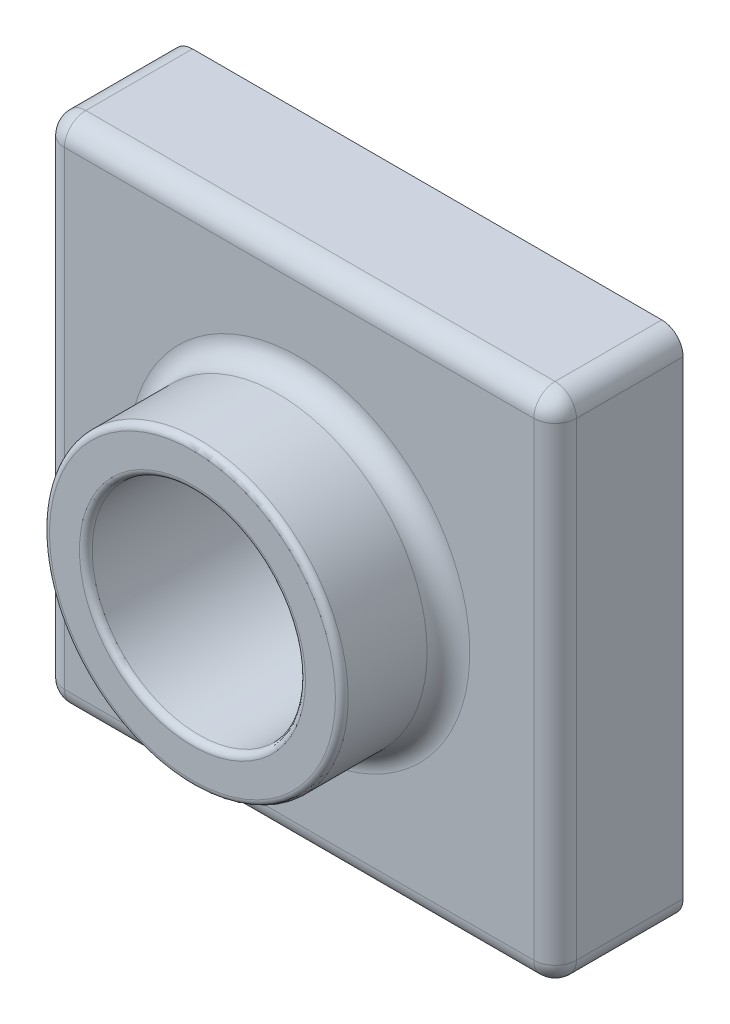
ISO-10303-21;
HEADER;
FILE_DESCRIPTION(('STEP AP214'),'2;1');
FILE_NAME('part.step','',(''),(''),'','','');
FILE_SCHEMA(('AUTOMOTIVE_DESIGN { 1 0 10303 214 1 1 1 1 }'));
ENDSEC;
DATA;
#1=APPLICATION_CONTEXT('core data for automotive mechanical design processes');
#2=APPLICATION_PROTOCOL_DEFINITION('international standard','automotive_design',2000,#1);
#3=PRODUCT_CONTEXT('',#1,'mechanical');
#4=PRODUCT('Part','Part','',(#3));
#5=PRODUCT_RELATED_PRODUCT_CATEGORY('part','',(#4));
#6=PRODUCT_DEFINITION_FORMATION('','',#4);
#7=PRODUCT_DEFINITION_CONTEXT('part definition',#1,'design');
#8=PRODUCT_DEFINITION('design','',#6,#7);
#9=PRODUCT_DEFINITION_SHAPE('','',#8);
#10=(LENGTH_UNIT() NAMED_UNIT(*) SI_UNIT(.MILLI.,.METRE.));
#11=(NAMED_UNIT(*) PLANE_ANGLE_UNIT() SI_UNIT($,.RADIAN.));
#12=(NAMED_UNIT(*) SI_UNIT($,.STERADIAN.) SOLID_ANGLE_UNIT());
#13=UNCERTAINTY_MEASURE_WITH_UNIT(LENGTH_MEASURE(1.E-05),#10,'distance_accuracy_value','');
#14=(GEOMETRIC_REPRESENTATION_CONTEXT(3) GLOBAL_UNCERTAINTY_ASSIGNED_CONTEXT((#13)) GLOBAL_UNIT_ASSIGNED_CONTEXT((#10,
#11,#12)) REPRESENTATION_CONTEXT('',''));
#15=CARTESIAN_POINT('',(0.,0.,0.));
#16=DIRECTION('',(0.,0.,1.));
#17=DIRECTION('',(1.,0.,0.));
#18=AXIS2_PLACEMENT_3D('',#15,#16,#17);
#19=CARTESIAN_POINT('',(0.,0.,0.));
#20=DIRECTION('',(0.,0.,-1.));
#21=DIRECTION('',(-1.,0.,0.));
#22=AXIS2_PLACEMENT_3D('',#19,#20,#21);
#23=PLANE('',#22);
#24=DIRECTION('',(1.,0.,0.));
#25=VECTOR('',#24,1.);
#26=CARTESIAN_POINT('',(0.,0.,0.));
#27=LINE('',#26,#25);
#28=CARTESIAN_POINT('',(5.,0.,0.));
#29=VERTEX_POINT('',#28);
#30=CARTESIAN_POINT('',(115.,0.,0.));
#31=VERTEX_POINT('',#30);
#32=EDGE_CURVE('E280',#29,#31,#27,.T.);
#33=ORIENTED_EDGE('',*,*,#32,.F.);
#34=CARTESIAN_POINT('',(5.,5.,0.));
#35=DIRECTION('',(0.,0.,-1.));
#36=DIRECTION('',(-1.,0.,0.));
#37=AXIS2_PLACEMENT_3D('',#34,#35,#36);
#38=CIRCLE('',#37,5.);
#39=CARTESIAN_POINT('',(0.,5.,0.));
#40=VERTEX_POINT('',#39);
#41=EDGE_CURVE('E311',#29,#40,#38,.T.);
#42=ORIENTED_EDGE('',*,*,#41,.T.);
#43=DIRECTION('',(0.,-1.,0.));
#44=VECTOR('',#43,1.);
#45=CARTESIAN_POINT('',(0.,0.,0.));
#46=LINE('',#45,#44);
#47=CARTESIAN_POINT('',(0.,115.,0.));
#48=VERTEX_POINT('',#47);
#49=EDGE_CURVE('E275',#48,#40,#46,.T.);
#50=ORIENTED_EDGE('',*,*,#49,.F.);
#51=CARTESIAN_POINT('',(5.,115.,0.));
#52=DIRECTION('',(0.,0.,-1.));
#53=DIRECTION('',(-1.,0.,0.));
#54=AXIS2_PLACEMENT_3D('',#51,#52,#53);
#55=CIRCLE('',#54,5.);
#56=CARTESIAN_POINT('',(5.,120.,0.));
#57=VERTEX_POINT('',#56);
#58=EDGE_CURVE('E308',#48,#57,#55,.T.);
#59=ORIENTED_EDGE('',*,*,#58,.T.);
#60=DIRECTION('',(-1.,0.,0.));
#61=VECTOR('',#60,1.);
#62=CARTESIAN_POINT('',(0.,120.,0.));
#63=LINE('',#62,#61);
#64=CARTESIAN_POINT('',(115.,120.,0.));
#65=VERTEX_POINT('',#64);
#66=EDGE_CURVE('E288',#65,#57,#63,.T.);
#67=ORIENTED_EDGE('',*,*,#66,.F.);
#68=CARTESIAN_POINT('',(115.,115.,0.));
#69=DIRECTION('',(0.,0.,-1.));
#70=DIRECTION('',(-1.,0.,0.));
#71=AXIS2_PLACEMENT_3D('',#68,#69,#70);
#72=CIRCLE('',#71,5.);
#73=CARTESIAN_POINT('',(120.,115.,0.));
#74=VERTEX_POINT('',#73);
#75=EDGE_CURVE('E302',#65,#74,#72,.T.);
#76=ORIENTED_EDGE('',*,*,#75,.T.);
#77=DIRECTION('',(0.,1.,0.));
#78=VECTOR('',#77,1.);
#79=CARTESIAN_POINT('',(120.,0.,0.));
#80=LINE('',#79,#78);
#81=CARTESIAN_POINT('',(120.,5.,0.));
#82=VERTEX_POINT('',#81);
#83=EDGE_CURVE('E284',#82,#74,#80,.T.);
#84=ORIENTED_EDGE('',*,*,#83,.F.);
#85=CARTESIAN_POINT('',(115.,5.,0.));
#86=DIRECTION('',(0.,0.,-1.));
#87=DIRECTION('',(-1.,0.,0.));
#88=AXIS2_PLACEMENT_3D('',#85,#86,#87);
#89=CIRCLE('',#88,5.);
#90=EDGE_CURVE('E305',#82,#31,#89,.T.);
#91=ORIENTED_EDGE('',*,*,#90,.T.);
#92=EDGE_LOOP('',(#33,#42,#50,#59,#67,#76,#84,#91));
#93=FACE_BOUND('',#92,.T.);
#94=CARTESIAN_POINT('',(5.,5.,0.));
#95=DIRECTION('',(0.,0.,-1.));
#96=DIRECTION('',(-1.,0.,0.));
#97=AXIS2_PLACEMENT_3D('',#94,#95,#96);
#98=CIRCLE('',#97,3.);
#99=CARTESIAN_POINT('',(5.,2.,0.));
#100=VERTEX_POINT('',#99);
#101=CARTESIAN_POINT('',(2.,5.,0.));
#102=VERTEX_POINT('',#101);
#103=EDGE_CURVE('E189',#100,#102,#98,.T.);
#104=ORIENTED_EDGE('',*,*,#103,.F.);
#105=DIRECTION('',(1.,0.,0.));
#106=VECTOR('',#105,1.);
#107=CARTESIAN_POINT('',(0.,2.,0.));
#108=LINE('',#107,#106);
#109=CARTESIAN_POINT('',(115.,2.,0.));
#110=VERTEX_POINT('',#109);
#111=EDGE_CURVE('E243',#100,#110,#108,.T.);
#112=ORIENTED_EDGE('',*,*,#111,.T.);
#113=CARTESIAN_POINT('',(115.,5.,0.));
#114=DIRECTION('',(0.,0.,-1.));
#115=DIRECTION('',(-1.,0.,0.));
#116=AXIS2_PLACEMENT_3D('',#113,#114,#115);
#117=CIRCLE('',#116,3.);
#118=CARTESIAN_POINT('',(118.,5.,0.));
#119=VERTEX_POINT('',#118);
#120=EDGE_CURVE('E248',#119,#110,#117,.T.);
#121=ORIENTED_EDGE('',*,*,#120,.F.);
#122=DIRECTION('',(0.,1.,0.));
#123=VECTOR('',#122,1.);
#124=CARTESIAN_POINT('',(118.,0.,0.));
#125=LINE('',#124,#123);
#126=CARTESIAN_POINT('',(118.,115.,0.));
#127=VERTEX_POINT('',#126);
#128=EDGE_CURVE('E58',#119,#127,#125,.T.);
#129=ORIENTED_EDGE('',*,*,#128,.T.);
#130=CARTESIAN_POINT('',(115.,115.,0.));
#131=DIRECTION('',(0.,0.,-1.));
#132=DIRECTION('',(-1.,0.,0.));
#133=AXIS2_PLACEMENT_3D('',#130,#131,#132);
#134=CIRCLE('',#133,3.);
#135=CARTESIAN_POINT('',(115.,118.,0.));
#136=VERTEX_POINT('',#135);
#137=EDGE_CURVE('E254',#136,#127,#134,.T.);
#138=ORIENTED_EDGE('',*,*,#137,.F.);
#139=DIRECTION('',(-1.,0.,0.));
#140=VECTOR('',#139,1.);
#141=CARTESIAN_POINT('',(0.,118.,0.));
#142=LINE('',#141,#140);
#143=CARTESIAN_POINT('',(5.,118.,0.));
#144=VERTEX_POINT('',#143);
#145=EDGE_CURVE('E249',#136,#144,#142,.T.);
#146=ORIENTED_EDGE('',*,*,#145,.T.);
#147=CARTESIAN_POINT('',(5.,115.,0.));
#148=DIRECTION('',(0.,0.,-1.));
#149=DIRECTION('',(-1.,0.,0.));
#150=AXIS2_PLACEMENT_3D('',#147,#148,#149);
#151=CIRCLE('',#150,3.);
#152=CARTESIAN_POINT('',(2.,115.,0.));
#153=VERTEX_POINT('',#152);
#154=EDGE_CURVE('E245',#153,#144,#151,.T.);
#155=ORIENTED_EDGE('',*,*,#154,.F.);
#156=DIRECTION('',(0.,-1.,0.));
#157=VECTOR('',#156,1.);
#158=CARTESIAN_POINT('',(2.,0.,0.));
#159=LINE('',#158,#157);
#160=EDGE_CURVE('E240',#153,#102,#159,.T.);
#161=ORIENTED_EDGE('',*,*,#160,.T.);
#162=EDGE_LOOP('',(#104,#112,#121,#129,#138,#146,#155,#161));
#163=FACE_BOUND('',#162,.T.);
#164=ADVANCED_FACE('F42',(#93,#163),#23,.T.);
#165=CARTESIAN_POINT('',(0.,0.,30.));
#166=DIRECTION('',(1.,0.,0.));
#167=DIRECTION('',(0.,0.,-1.));
#168=AXIS2_PLACEMENT_3D('',#165,#166,#167);
#169=PLANE('',#168);
#170=ORIENTED_EDGE('',*,*,#49,.T.);
#171=DIRECTION('',(0.,0.,-1.));
#172=VECTOR('',#171,1.);
#173=CARTESIAN_POINT('',(0.,5.,30.));
#174=LINE('',#173,#172);
#175=CARTESIAN_POINT('',(0.,5.,25.));
#176=VERTEX_POINT('',#175);
#177=EDGE_CURVE('E320',#40,#176,#174,.F.);
#178=ORIENTED_EDGE('',*,*,#177,.T.);
#179=DIRECTION('',(0.,-1.,0.));
#180=VECTOR('',#179,1.);
#181=CARTESIAN_POINT('',(0.,0.,25.));
#182=LINE('',#181,#180);
#183=CARTESIAN_POINT('',(0.,115.,25.));
#184=VERTEX_POINT('',#183);
#185=EDGE_CURVE('E314',#176,#184,#182,.F.);
#186=ORIENTED_EDGE('',*,*,#185,.T.);
#187=DIRECTION('',(0.,0.,-1.));
#188=VECTOR('',#187,1.);
#189=CARTESIAN_POINT('',(0.,115.,30.));
#190=LINE('',#189,#188);
#191=EDGE_CURVE('E317',#184,#48,#190,.T.);
#192=ORIENTED_EDGE('',*,*,#191,.T.);
#193=EDGE_LOOP('',(#170,#178,#186,#192));
#194=FACE_BOUND('',#193,.T.);
#195=ADVANCED_FACE('F451',(#194),#169,.F.);
#196=CARTESIAN_POINT('',(0.,0.,30.));
#197=DIRECTION('',(0.,1.,0.));
#198=DIRECTION('',(0.,0.,1.));
#199=AXIS2_PLACEMENT_3D('',#196,#197,#198);
#200=PLANE('',#199);
#201=DIRECTION('',(1.,0.,0.));
#202=VECTOR('',#201,1.);
#203=CARTESIAN_POINT('',(0.,0.,25.));
#204=LINE('',#203,#202);
#205=CARTESIAN_POINT('',(115.,0.,25.));
#206=VERTEX_POINT('',#205);
#207=CARTESIAN_POINT('',(5.,0.,25.));
#208=VERTEX_POINT('',#207);
#209=EDGE_CURVE('E295',#206,#208,#204,.F.);
#210=ORIENTED_EDGE('',*,*,#209,.T.);
#211=DIRECTION('',(0.,0.,-1.));
#212=VECTOR('',#211,1.);
#213=CARTESIAN_POINT('',(5.,0.,30.));
#214=LINE('',#213,#212);
#215=EDGE_CURVE('E298',#208,#29,#214,.T.);
#216=ORIENTED_EDGE('',*,*,#215,.T.);
#217=ORIENTED_EDGE('',*,*,#32,.T.);
#218=DIRECTION('',(0.,0.,-1.));
#219=VECTOR('',#218,1.);
#220=CARTESIAN_POINT('',(115.,0.,30.));
#221=LINE('',#220,#219);
#222=EDGE_CURVE('E292',#31,#206,#221,.F.);
#223=ORIENTED_EDGE('',*,*,#222,.T.);
#224=EDGE_LOOP('',(#210,#216,#217,#223));
#225=FACE_BOUND('',#224,.T.);
#226=ADVANCED_FACE('F456',(#225),#200,.F.);
#227=CARTESIAN_POINT('',(120.,0.,30.));
#228=DIRECTION('',(-1.,0.,0.));
#229=DIRECTION('',(0.,0.,1.));
#230=AXIS2_PLACEMENT_3D('',#227,#228,#229);
#231=PLANE('',#230);
#232=DIRECTION('',(0.,1.,0.));
#233=VECTOR('',#232,1.);
#234=CARTESIAN_POINT('',(120.,0.,25.));
#235=LINE('',#234,#233);
#236=CARTESIAN_POINT('',(120.,115.,25.));
#237=VERTEX_POINT('',#236);
#238=CARTESIAN_POINT('',(120.,5.,25.));
#239=VERTEX_POINT('',#238);
#240=EDGE_CURVE('E66',#237,#239,#235,.F.);
#241=ORIENTED_EDGE('',*,*,#240,.T.);
#242=DIRECTION('',(0.,0.,-1.));
#243=VECTOR('',#242,1.);
#244=CARTESIAN_POINT('',(120.,5.,30.));
#245=LINE('',#244,#243);
#246=EDGE_CURVE('E354',#239,#82,#245,.T.);
#247=ORIENTED_EDGE('',*,*,#246,.T.);
#248=ORIENTED_EDGE('',*,*,#83,.T.);
#249=DIRECTION('',(0.,0.,-1.));
#250=VECTOR('',#249,1.);
#251=CARTESIAN_POINT('',(120.,115.,30.));
#252=LINE('',#251,#250);
#253=EDGE_CURVE('E349',#74,#237,#252,.F.);
#254=ORIENTED_EDGE('',*,*,#253,.T.);
#255=EDGE_LOOP('',(#241,#247,#248,#254));
#256=FACE_BOUND('',#255,.T.);
#257=ADVANCED_FACE('F1015',(#256),#231,.F.);
#258=CARTESIAN_POINT('',(0.,120.,30.));
#259=DIRECTION('',(0.,-1.,0.));
#260=DIRECTION('',(0.,0.,-1.));
#261=AXIS2_PLACEMENT_3D('',#258,#259,#260);
#262=PLANE('',#261);
#263=ORIENTED_EDGE('',*,*,#66,.T.);
#264=DIRECTION('',(0.,0.,-1.));
#265=VECTOR('',#264,1.);
#266=CARTESIAN_POINT('',(5.,120.,30.));
#267=LINE('',#266,#265);
#268=CARTESIAN_POINT('',(5.,120.,25.));
#269=VERTEX_POINT('',#268);
#270=EDGE_CURVE('E329',#57,#269,#267,.F.);
#271=ORIENTED_EDGE('',*,*,#270,.T.);
#272=DIRECTION('',(-1.,0.,0.));
#273=VECTOR('',#272,1.);
#274=CARTESIAN_POINT('',(0.,120.,25.));
#275=LINE('',#274,#273);
#276=CARTESIAN_POINT('',(115.,120.,25.));
#277=VERTEX_POINT('',#276);
#278=EDGE_CURVE('E326',#269,#277,#275,.F.);
#279=ORIENTED_EDGE('',*,*,#278,.T.);
#280=DIRECTION('',(0.,0.,-1.));
#281=VECTOR('',#280,1.);
#282=CARTESIAN_POINT('',(115.,120.,30.));
#283=LINE('',#282,#281);
#284=EDGE_CURVE('E323',#277,#65,#283,.T.);
#285=ORIENTED_EDGE('',*,*,#284,.T.);
#286=EDGE_LOOP('',(#263,#271,#279,#285));
#287=FACE_BOUND('',#286,.T.);
#288=ADVANCED_FACE('F445',(#287),#262,.F.);
#289=CARTESIAN_POINT('',(0.,0.,30.));
#290=DIRECTION('',(0.,0.,-1.));
#291=DIRECTION('',(-1.,0.,0.));
#292=AXIS2_PLACEMENT_3D('',#289,#290,#291);
#293=PLANE('',#292);
#294=DIRECTION('',(-1.,0.,0.));
#295=VECTOR('',#294,1.);
#296=CARTESIAN_POINT('',(0.,115.,30.));
#297=LINE('',#296,#295);
#298=CARTESIAN_POINT('',(115.,115.,30.));
#299=VERTEX_POINT('',#298);
#300=CARTESIAN_POINT('',(5.,115.,30.));
#301=VERTEX_POINT('',#300);
#302=EDGE_CURVE('E336',#299,#301,#297,.T.);
#303=ORIENTED_EDGE('',*,*,#302,.T.);
#304=DIRECTION('',(0.,-1.,0.));
#305=VECTOR('',#304,1.);
#306=CARTESIAN_POINT('',(5.,0.,30.));
#307=LINE('',#306,#305);
#308=CARTESIAN_POINT('',(5.,5.,30.));
#309=VERTEX_POINT('',#308);
#310=EDGE_CURVE('E345',#301,#309,#307,.T.);
#311=ORIENTED_EDGE('',*,*,#310,.T.);
#312=DIRECTION('',(1.,0.,0.));
#313=VECTOR('',#312,1.);
#314=CARTESIAN_POINT('',(0.,5.,30.));
#315=LINE('',#314,#313);
#316=CARTESIAN_POINT('',(115.,5.,30.));
#317=VERTEX_POINT('',#316);
#318=EDGE_CURVE('E342',#309,#317,#315,.T.);
#319=ORIENTED_EDGE('',*,*,#318,.T.);
#320=DIRECTION('',(0.,1.,0.));
#321=VECTOR('',#320,1.);
#322=CARTESIAN_POINT('',(115.,0.,30.));
#323=LINE('',#322,#321);
#324=EDGE_CURVE('E339',#317,#299,#323,.T.);
#325=ORIENTED_EDGE('',*,*,#324,.T.);
#326=EDGE_LOOP('',(#303,#311,#319,#325));
#327=FACE_BOUND('',#326,.T.);
#328=CARTESIAN_POINT('',(60.,60.,30.));
#329=DIRECTION('',(0.,0.,-1.));
#330=DIRECTION('',(-1.,0.,0.));
#331=AXIS2_PLACEMENT_3D('',#328,#329,#330);
#332=CIRCLE('',#331,40.);
#333=CARTESIAN_POINT('',(20.,60.,30.));
#334=VERTEX_POINT('',#333);
#335=EDGE_CURVE('E332',#334,#334,#332,.T.);
#336=ORIENTED_EDGE('',*,*,#335,.T.);
#337=EDGE_LOOP('',(#336));
#338=FACE_BOUND('',#337,.T.);
#339=ADVANCED_FACE('F436',(#327,#338),#293,.F.);
#340=CARTESIAN_POINT('',(60.,60.,0.));
#341=DIRECTION('',(0.,0.,-1.));
#342=DIRECTION('',(-1.,0.,0.));
#343=AXIS2_PLACEMENT_3D('',#340,#341,#342);
#344=CIRCLE('',#343,27.);
#345=CARTESIAN_POINT('',(33.,60.,0.));
#346=VERTEX_POINT('',#345);
#347=EDGE_CURVE('E244',#346,#346,#344,.F.);
#348=ORIENTED_EDGE('',*,*,#347,.F.);
#349=EDGE_LOOP('',(#348));
#350=FACE_BOUND('',#349,.T.);
#351=CARTESIAN_POINT('',(60.,60.,0.));
#352=DIRECTION('',(0.,0.,1.));
#353=DIRECTION('',(1.,0.,0.));
#354=AXIS2_PLACEMENT_3D('',#351,#352,#353);
#355=CIRCLE('',#354,25.);
#356=CARTESIAN_POINT('',(85.,60.,0.));
#357=VERTEX_POINT('',#356);
#358=EDGE_CURVE('E271',#357,#357,#355,.T.);
#359=ORIENTED_EDGE('',*,*,#358,.T.);
#360=EDGE_LOOP('',(#359));
#361=FACE_BOUND('',#360,.T.);
#362=ADVANCED_FACE('F433',(#350,#361),#23,.T.);
#363=CARTESIAN_POINT('',(60.,60.,55.));
#364=DIRECTION('',(0.,0.,-1.));
#365=DIRECTION('',(-1.,0.,0.));
#366=AXIS2_PLACEMENT_3D('',#363,#364,#365);
#367=CYLINDRICAL_SURFACE('',#366,35.);
#368=CARTESIAN_POINT('',(60.,60.,53.5));
#369=DIRECTION('',(0.,0.,1.));
#370=DIRECTION('',(1.,0.,0.));
#371=AXIS2_PLACEMENT_3D('',#368,#369,#370);
#372=CIRCLE('',#371,35.);
#373=CARTESIAN_POINT('',(95.,60.,53.5));
#374=VERTEX_POINT('',#373);
#375=EDGE_CURVE('E11',#374,#374,#372,.F.);
#376=ORIENTED_EDGE('',*,*,#375,.T.);
#377=EDGE_LOOP('',(#376));
#378=FACE_BOUND('',#377,.T.);
#379=CARTESIAN_POINT('',(60.,60.,35.));
#380=DIRECTION('',(0.,0.,-1.));
#381=DIRECTION('',(-1.,0.,0.));
#382=AXIS2_PLACEMENT_3D('',#379,#380,#381);
#383=CIRCLE('',#382,35.);
#384=CARTESIAN_POINT('',(25.,60.,35.));
#385=VERTEX_POINT('',#384);
#386=EDGE_CURVE('E357',#385,#385,#383,.F.);
#387=ORIENTED_EDGE('',*,*,#386,.T.);
#388=EDGE_LOOP('',(#387));
#389=FACE_BOUND('',#388,.T.);
#390=ADVANCED_FACE('F435',(#378,#389),#367,.T.);
#391=CARTESIAN_POINT('',(60.,60.,55.));
#392=DIRECTION('',(0.,0.,1.));
#393=DIRECTION('',(1.,0.,0.));
#394=AXIS2_PLACEMENT_3D('',#391,#392,#393);
#395=PLANE('',#394);
#396=CARTESIAN_POINT('',(60.,60.,55.));
#397=DIRECTION('',(0.,0.,1.));
#398=DIRECTION('',(1.,0.,0.));
#399=AXIS2_PLACEMENT_3D('',#396,#397,#398);
#400=CIRCLE('',#399,26.5);
#401=CARTESIAN_POINT('',(86.5,60.,55.));
#402=VERTEX_POINT('',#401);
#403=EDGE_CURVE('E51',#402,#402,#400,.F.);
#404=ORIENTED_EDGE('',*,*,#403,.T.);
#405=EDGE_LOOP('',(#404));
#406=FACE_BOUND('',#405,.T.);
#407=CARTESIAN_POINT('',(60.,60.,55.));
#408=DIRECTION('',(0.,0.,1.));
#409=DIRECTION('',(1.,0.,0.));
#410=AXIS2_PLACEMENT_3D('',#407,#408,#409);
#411=CIRCLE('',#410,33.5);
#412=CARTESIAN_POINT('',(93.5,60.,55.));
#413=VERTEX_POINT('',#412);
#414=EDGE_CURVE('E410',#413,#413,#411,.T.);
#415=ORIENTED_EDGE('',*,*,#414,.T.);
#416=EDGE_LOOP('',(#415));
#417=FACE_BOUND('',#416,.T.);
#418=ADVANCED_FACE('F417',(#406,#417),#395,.T.);
#419=CARTESIAN_POINT('',(60.,60.,0.));
#420=DIRECTION('',(0.,0.,1.));
#421=DIRECTION('',(1.,0.,0.));
#422=AXIS2_PLACEMENT_3D('',#419,#420,#421);
#423=CYLINDRICAL_SURFACE('',#422,25.);
#424=CARTESIAN_POINT('',(60.,60.,53.5));
#425=DIRECTION('',(0.,0.,1.));
#426=DIRECTION('',(1.,0.,0.));
#427=AXIS2_PLACEMENT_3D('',#424,#425,#426);
#428=CIRCLE('',#427,25.);
#429=CARTESIAN_POINT('',(85.,60.,53.5));
#430=VERTEX_POINT('',#429);
#431=EDGE_CURVE('E361',#430,#430,#428,.T.);
#432=ORIENTED_EDGE('',*,*,#431,.T.);
#433=EDGE_LOOP('',(#432));
#434=FACE_BOUND('',#433,.T.);
#435=ORIENTED_EDGE('',*,*,#358,.F.);
#436=EDGE_LOOP('',(#435));
#437=FACE_BOUND('',#436,.T.);
#438=ADVANCED_FACE('F426',(#434,#437),#423,.F.);
#439=CARTESIAN_POINT('',(115.,115.,30.));
#440=DIRECTION('',(0.,0.,-1.));
#441=DIRECTION('',(-1.,0.,0.));
#442=AXIS2_PLACEMENT_3D('',#439,#440,#441);
#443=CYLINDRICAL_SURFACE('',#442,5.);
#444=CARTESIAN_POINT('',(115.,115.,25.));
#445=DIRECTION('',(0.,0.,1.));
#446=DIRECTION('',(1.,0.,0.));
#447=AXIS2_PLACEMENT_3D('',#444,#445,#446);
#448=CIRCLE('',#447,5.);
#449=EDGE_CURVE('E276',#237,#277,#448,.T.);
#450=ORIENTED_EDGE('',*,*,#449,.F.);
#451=ORIENTED_EDGE('',*,*,#253,.F.);
#452=ORIENTED_EDGE('',*,*,#75,.F.);
#453=ORIENTED_EDGE('',*,*,#284,.F.);
#454=EDGE_LOOP('',(#450,#451,#452,#453));
#455=FACE_BOUND('',#454,.T.);
#456=ADVANCED_FACE('F429',(#455),#443,.T.);
#457=CARTESIAN_POINT('',(115.,115.,25.));
#458=DIRECTION('',(0.,1.,0.));
#459=DIRECTION('',(0.,0.,1.));
#460=AXIS2_PLACEMENT_3D('',#457,#458,#459);
#461=SPHERICAL_SURFACE('',#460,5.);
#462=CARTESIAN_POINT('',(115.,115.,25.));
#463=DIRECTION('',(0.,1.,0.));
#464=DIRECTION('',(0.,0.,1.));
#465=AXIS2_PLACEMENT_3D('',#462,#463,#464);
#466=CIRCLE('',#465,5.);
#467=EDGE_CURVE('E396',#237,#299,#466,.F.);
#468=ORIENTED_EDGE('',*,*,#467,.F.);
#469=ORIENTED_EDGE('',*,*,#449,.T.);
#470=CARTESIAN_POINT('',(115.,115.,25.));
#471=DIRECTION('',(1.,0.,0.));
#472=DIRECTION('',(0.,0.,-1.));
#473=AXIS2_PLACEMENT_3D('',#470,#471,#472);
#474=CIRCLE('',#473,5.);
#475=EDGE_CURVE('E400',#299,#277,#474,.F.);
#476=ORIENTED_EDGE('',*,*,#475,.F.);
#477=EDGE_LOOP('',(#468,#469,#476));
#478=FACE_BOUND('',#477,.T.);
#479=ADVANCED_FACE('F622',(#478),#461,.T.);
#480=CARTESIAN_POINT('',(5.,115.,30.));
#481=DIRECTION('',(0.,0.,-1.));
#482=DIRECTION('',(-1.,0.,0.));
#483=AXIS2_PLACEMENT_3D('',#480,#481,#482);
#484=CYLINDRICAL_SURFACE('',#483,5.);
#485=ORIENTED_EDGE('',*,*,#58,.F.);
#486=ORIENTED_EDGE('',*,*,#191,.F.);
#487=CARTESIAN_POINT('',(5.,115.,25.));
#488=DIRECTION('',(0.,0.,1.));
#489=DIRECTION('',(1.,0.,0.));
#490=AXIS2_PLACEMENT_3D('',#487,#488,#489);
#491=CIRCLE('',#490,5.);
#492=EDGE_CURVE('E392',#269,#184,#491,.T.);
#493=ORIENTED_EDGE('',*,*,#492,.F.);
#494=ORIENTED_EDGE('',*,*,#270,.F.);
#495=EDGE_LOOP('',(#485,#486,#493,#494));
#496=FACE_BOUND('',#495,.T.);
#497=ADVANCED_FACE('F631',(#496),#484,.T.);
#498=CARTESIAN_POINT('',(0.,115.,25.));
#499=DIRECTION('',(-1.,0.,0.));
#500=DIRECTION('',(0.,0.,1.));
#501=AXIS2_PLACEMENT_3D('',#498,#499,#500);
#502=CYLINDRICAL_SURFACE('',#501,5.);
#503=ORIENTED_EDGE('',*,*,#475,.T.);
#504=ORIENTED_EDGE('',*,*,#278,.F.);
#505=CARTESIAN_POINT('',(5.,115.,25.));
#506=DIRECTION('',(-1.,0.,0.));
#507=DIRECTION('',(0.,0.,1.));
#508=AXIS2_PLACEMENT_3D('',#505,#506,#507);
#509=CIRCLE('',#508,5.);
#510=EDGE_CURVE('E388',#301,#269,#509,.T.);
#511=ORIENTED_EDGE('',*,*,#510,.F.);
#512=ORIENTED_EDGE('',*,*,#302,.F.);
#513=EDGE_LOOP('',(#503,#504,#511,#512));
#514=FACE_BOUND('',#513,.T.);
#515=ADVANCED_FACE('F639',(#514),#502,.T.);
#516=CARTESIAN_POINT('',(115.,0.,25.));
#517=DIRECTION('',(0.,1.,0.));
#518=DIRECTION('',(0.,0.,1.));
#519=AXIS2_PLACEMENT_3D('',#516,#517,#518);
#520=CYLINDRICAL_SURFACE('',#519,5.);
#521=ORIENTED_EDGE('',*,*,#467,.T.);
#522=ORIENTED_EDGE('',*,*,#324,.F.);
#523=CARTESIAN_POINT('',(115.,5.,25.));
#524=DIRECTION('',(0.,-1.,0.));
#525=DIRECTION('',(0.,0.,-1.));
#526=AXIS2_PLACEMENT_3D('',#523,#524,#525);
#527=CIRCLE('',#526,5.);
#528=EDGE_CURVE('E384',#239,#317,#527,.T.);
#529=ORIENTED_EDGE('',*,*,#528,.F.);
#530=ORIENTED_EDGE('',*,*,#240,.F.);
#531=EDGE_LOOP('',(#521,#522,#529,#530));
#532=FACE_BOUND('',#531,.T.);
#533=ADVANCED_FACE('F647',(#532),#520,.T.);
#534=CARTESIAN_POINT('',(115.,5.,30.));
#535=DIRECTION('',(0.,0.,-1.));
#536=DIRECTION('',(-1.,0.,0.));
#537=AXIS2_PLACEMENT_3D('',#534,#535,#536);
#538=CYLINDRICAL_SURFACE('',#537,5.);
#539=ORIENTED_EDGE('',*,*,#90,.F.);
#540=ORIENTED_EDGE('',*,*,#246,.F.);
#541=CARTESIAN_POINT('',(115.,5.,25.));
#542=DIRECTION('',(0.,0.,1.));
#543=DIRECTION('',(1.,0.,0.));
#544=AXIS2_PLACEMENT_3D('',#541,#542,#543);
#545=CIRCLE('',#544,5.);
#546=EDGE_CURVE('E380',#206,#239,#545,.T.);
#547=ORIENTED_EDGE('',*,*,#546,.F.);
#548=ORIENTED_EDGE('',*,*,#222,.F.);
#549=EDGE_LOOP('',(#539,#540,#547,#548));
#550=FACE_BOUND('',#549,.T.);
#551=ADVANCED_FACE('F655',(#550),#538,.T.);
#552=CARTESIAN_POINT('',(5.,115.,25.));
#553=DIRECTION('',(0.,1.,0.));
#554=DIRECTION('',(0.,0.,1.));
#555=AXIS2_PLACEMENT_3D('',#552,#553,#554);
#556=SPHERICAL_SURFACE('',#555,5.);
#557=ORIENTED_EDGE('',*,*,#510,.T.);
#558=ORIENTED_EDGE('',*,*,#492,.T.);
#559=CARTESIAN_POINT('',(5.,115.,25.));
#560=DIRECTION('',(0.,1.,0.));
#561=DIRECTION('',(0.,0.,1.));
#562=AXIS2_PLACEMENT_3D('',#559,#560,#561);
#563=CIRCLE('',#562,5.);
#564=EDGE_CURVE('E376',#301,#184,#563,.F.);
#565=ORIENTED_EDGE('',*,*,#564,.F.);
#566=EDGE_LOOP('',(#557,#558,#565));
#567=FACE_BOUND('',#566,.T.);
#568=ADVANCED_FACE('F663',(#567),#556,.T.);
#569=CARTESIAN_POINT('',(115.,5.,25.));
#570=DIRECTION('',(1.,0.,0.));
#571=DIRECTION('',(0.,0.,-1.));
#572=AXIS2_PLACEMENT_3D('',#569,#570,#571);
#573=SPHERICAL_SURFACE('',#572,5.);
#574=ORIENTED_EDGE('',*,*,#546,.T.);
#575=ORIENTED_EDGE('',*,*,#528,.T.);
#576=CARTESIAN_POINT('',(115.,5.,25.));
#577=DIRECTION('',(1.,0.,0.));
#578=DIRECTION('',(0.,0.,-1.));
#579=AXIS2_PLACEMENT_3D('',#576,#577,#578);
#580=CIRCLE('',#579,5.);
#581=EDGE_CURVE('E372',#206,#317,#580,.F.);
#582=ORIENTED_EDGE('',*,*,#581,.F.);
#583=EDGE_LOOP('',(#574,#575,#582));
#584=FACE_BOUND('',#583,.T.);
#585=ADVANCED_FACE('F671',(#584),#573,.T.);
#586=CARTESIAN_POINT('',(5.,0.,25.));
#587=DIRECTION('',(0.,-1.,0.));
#588=DIRECTION('',(0.,0.,-1.));
#589=AXIS2_PLACEMENT_3D('',#586,#587,#588);
#590=CYLINDRICAL_SURFACE('',#589,5.);
#591=ORIENTED_EDGE('',*,*,#564,.T.);
#592=ORIENTED_EDGE('',*,*,#185,.F.);
#593=CARTESIAN_POINT('',(5.,5.,25.));
#594=DIRECTION('',(0.,-1.,0.));
#595=DIRECTION('',(0.,0.,-1.));
#596=AXIS2_PLACEMENT_3D('',#593,#594,#595);
#597=CIRCLE('',#596,5.);
#598=EDGE_CURVE('E368',#309,#176,#597,.T.);
#599=ORIENTED_EDGE('',*,*,#598,.F.);
#600=ORIENTED_EDGE('',*,*,#310,.F.);
#601=EDGE_LOOP('',(#591,#592,#599,#600));
#602=FACE_BOUND('',#601,.T.);
#603=ADVANCED_FACE('F679',(#602),#590,.T.);
#604=CARTESIAN_POINT('',(0.,5.,25.));
#605=DIRECTION('',(1.,0.,0.));
#606=DIRECTION('',(0.,0.,-1.));
#607=AXIS2_PLACEMENT_3D('',#604,#605,#606);
#608=CYLINDRICAL_SURFACE('',#607,5.);
#609=ORIENTED_EDGE('',*,*,#581,.T.);
#610=ORIENTED_EDGE('',*,*,#318,.F.);
#611=CARTESIAN_POINT('',(5.,5.,25.));
#612=DIRECTION('',(-1.,0.,0.));
#613=DIRECTION('',(0.,0.,1.));
#614=AXIS2_PLACEMENT_3D('',#611,#612,#613);
#615=CIRCLE('',#614,5.);
#616=EDGE_CURVE('E365',#208,#309,#615,.T.);
#617=ORIENTED_EDGE('',*,*,#616,.F.);
#618=ORIENTED_EDGE('',*,*,#209,.F.);
#619=EDGE_LOOP('',(#609,#610,#617,#618));
#620=FACE_BOUND('',#619,.T.);
#621=ADVANCED_FACE('F687',(#620),#608,.T.);
#622=CARTESIAN_POINT('',(5.,5.,25.));
#623=DIRECTION('',(0.,0.,1.));
#624=DIRECTION('',(1.,0.,0.));
#625=AXIS2_PLACEMENT_3D('',#622,#623,#624);
#626=SPHERICAL_SURFACE('',#625,5.);
#627=ORIENTED_EDGE('',*,*,#616,.T.);
#628=ORIENTED_EDGE('',*,*,#598,.T.);
#629=CARTESIAN_POINT('',(5.,5.,25.));
#630=DIRECTION('',(0.,0.,1.));
#631=DIRECTION('',(1.,0.,0.));
#632=AXIS2_PLACEMENT_3D('',#629,#630,#631);
#633=CIRCLE('',#632,5.);
#634=EDGE_CURVE('E236',#208,#176,#633,.F.);
#635=ORIENTED_EDGE('',*,*,#634,.F.);
#636=EDGE_LOOP('',(#627,#628,#635));
#637=FACE_BOUND('',#636,.T.);
#638=ADVANCED_FACE('F695',(#637),#626,.T.);
#639=CARTESIAN_POINT('',(5.,5.,30.));
#640=DIRECTION('',(0.,0.,-1.));
#641=DIRECTION('',(-1.,0.,0.));
#642=AXIS2_PLACEMENT_3D('',#639,#640,#641);
#643=CYLINDRICAL_SURFACE('',#642,5.);
#644=ORIENTED_EDGE('',*,*,#634,.T.);
#645=ORIENTED_EDGE('',*,*,#177,.F.);
#646=ORIENTED_EDGE('',*,*,#41,.F.);
#647=ORIENTED_EDGE('',*,*,#215,.F.);
#648=EDGE_LOOP('',(#644,#645,#646,#647));
#649=FACE_BOUND('',#648,.T.);
#650=ADVANCED_FACE('F703',(#649),#643,.T.);
#651=CARTESIAN_POINT('',(60.,60.,35.));
#652=DIRECTION('',(0.,0.,-1.));
#653=DIRECTION('',(-1.,0.,0.));
#654=AXIS2_PLACEMENT_3D('',#651,#652,#653);
#655=TOROIDAL_SURFACE('',#654,40.,5.);
#656=ORIENTED_EDGE('',*,*,#335,.F.);
#657=EDGE_LOOP('',(#656));
#658=FACE_BOUND('',#657,.T.);
#659=ORIENTED_EDGE('',*,*,#386,.F.);
#660=EDGE_LOOP('',(#659));
#661=FACE_BOUND('',#660,.T.);
#662=ADVANCED_FACE('F423',(#658,#661),#655,.F.);
#663=CARTESIAN_POINT('',(60.,60.,53.5));
#664=DIRECTION('',(0.,0.,1.));
#665=DIRECTION('',(1.,0.,0.));
#666=AXIS2_PLACEMENT_3D('',#663,#664,#665);
#667=TOROIDAL_SURFACE('',#666,26.5,1.5);
#668=ORIENTED_EDGE('',*,*,#403,.F.);
#669=EDGE_LOOP('',(#668));
#670=FACE_BOUND('',#669,.T.);
#671=ORIENTED_EDGE('',*,*,#431,.F.);
#672=EDGE_LOOP('',(#671));
#673=FACE_BOUND('',#672,.T.);
#674=ADVANCED_FACE('F420',(#670,#673),#667,.T.);
#675=CARTESIAN_POINT('',(60.,60.,53.5));
#676=DIRECTION('',(0.,0.,1.));
#677=DIRECTION('',(1.,0.,0.));
#678=AXIS2_PLACEMENT_3D('',#675,#676,#677);
#679=TOROIDAL_SURFACE('',#678,33.5,1.5);
#680=ORIENTED_EDGE('',*,*,#375,.F.);
#681=EDGE_LOOP('',(#680));
#682=FACE_BOUND('',#681,.T.);
#683=ORIENTED_EDGE('',*,*,#414,.F.);
#684=EDGE_LOOP('',(#683));
#685=FACE_BOUND('',#684,.T.);
#686=ADVANCED_FACE('F44',(#682,#685),#679,.T.);
#687=CARTESIAN_POINT('',(2.,0.,30.));
#688=DIRECTION('',(1.,0.,0.));
#689=DIRECTION('',(0.,0.,-1.));
#690=AXIS2_PLACEMENT_3D('',#687,#688,#689);
#691=PLANE('',#690);
#692=ORIENTED_EDGE('',*,*,#160,.F.);
#693=DIRECTION('',(0.,0.,-1.));
#694=VECTOR('',#693,1.);
#695=CARTESIAN_POINT('',(2.,115.,30.));
#696=LINE('',#695,#694);
#697=CARTESIAN_POINT('',(2.,115.,25.));
#698=VERTEX_POINT('',#697);
#699=EDGE_CURVE('E195',#698,#153,#696,.T.);
#700=ORIENTED_EDGE('',*,*,#699,.F.);
#701=DIRECTION('',(0.,1.,0.));
#702=VECTOR('',#701,1.);
#703=CARTESIAN_POINT('',(2.,0.,25.));
#704=LINE('',#703,#702);
#705=CARTESIAN_POINT('',(2.,5.,25.));
#706=VERTEX_POINT('',#705);
#707=EDGE_CURVE('E198',#706,#698,#704,.T.);
#708=ORIENTED_EDGE('',*,*,#707,.F.);
#709=DIRECTION('',(0.,0.,-1.));
#710=VECTOR('',#709,1.);
#711=CARTESIAN_POINT('',(2.,5.,30.));
#712=LINE('',#711,#710);
#713=EDGE_CURVE('E182',#102,#706,#712,.F.);
#714=ORIENTED_EDGE('',*,*,#713,.F.);
#715=EDGE_LOOP('',(#692,#700,#708,#714));
#716=FACE_BOUND('',#715,.T.);
#717=ADVANCED_FACE('F200',(#716),#691,.T.);
#718=CARTESIAN_POINT('',(0.,2.,30.));
#719=DIRECTION('',(0.,1.,0.));
#720=DIRECTION('',(0.,0.,1.));
#721=AXIS2_PLACEMENT_3D('',#718,#719,#720);
#722=PLANE('',#721);
#723=DIRECTION('',(1.,0.,0.));
#724=VECTOR('',#723,1.);
#725=CARTESIAN_POINT('',(0.,2.,25.));
#726=LINE('',#725,#724);
#727=CARTESIAN_POINT('',(115.,2.,25.));
#728=VERTEX_POINT('',#727);
#729=CARTESIAN_POINT('',(5.,2.,25.));
#730=VERTEX_POINT('',#729);
#731=EDGE_CURVE('E535',#728,#730,#726,.F.);
#732=ORIENTED_EDGE('',*,*,#731,.F.);
#733=DIRECTION('',(0.,0.,1.));
#734=VECTOR('',#733,1.);
#735=CARTESIAN_POINT('',(115.,2.,30.));
#736=LINE('',#735,#734);
#737=EDGE_CURVE('E253',#110,#728,#736,.T.);
#738=ORIENTED_EDGE('',*,*,#737,.F.);
#739=ORIENTED_EDGE('',*,*,#111,.F.);
#740=DIRECTION('',(0.,0.,1.));
#741=VECTOR('',#740,1.);
#742=CARTESIAN_POINT('',(5.,2.,30.));
#743=LINE('',#742,#741);
#744=EDGE_CURVE('E257',#730,#100,#743,.F.);
#745=ORIENTED_EDGE('',*,*,#744,.F.);
#746=EDGE_LOOP('',(#732,#738,#739,#745));
#747=FACE_BOUND('',#746,.T.);
#748=ADVANCED_FACE('F558',(#747),#722,.T.);
#749=CARTESIAN_POINT('',(118.,0.,30.));
#750=DIRECTION('',(-1.,0.,0.));
#751=DIRECTION('',(0.,0.,1.));
#752=AXIS2_PLACEMENT_3D('',#749,#750,#751);
#753=PLANE('',#752);
#754=DIRECTION('',(0.,1.,0.));
#755=VECTOR('',#754,1.);
#756=CARTESIAN_POINT('',(118.,0.,25.));
#757=LINE('',#756,#755);
#758=CARTESIAN_POINT('',(118.,115.,25.));
#759=VERTEX_POINT('',#758);
#760=CARTESIAN_POINT('',(118.,5.,25.));
#761=VERTEX_POINT('',#760);
#762=EDGE_CURVE('E498',#759,#761,#757,.F.);
#763=ORIENTED_EDGE('',*,*,#762,.F.);
#764=DIRECTION('',(0.,0.,1.));
#765=VECTOR('',#764,1.);
#766=CARTESIAN_POINT('',(118.,115.,30.));
#767=LINE('',#766,#765);
#768=EDGE_CURVE('E495',#127,#759,#767,.T.);
#769=ORIENTED_EDGE('',*,*,#768,.F.);
#770=ORIENTED_EDGE('',*,*,#128,.F.);
#771=DIRECTION('',(0.,0.,1.));
#772=VECTOR('',#771,1.);
#773=CARTESIAN_POINT('',(118.,5.,30.));
#774=LINE('',#773,#772);
#775=EDGE_CURVE('E231',#761,#119,#774,.F.);
#776=ORIENTED_EDGE('',*,*,#775,.F.);
#777=EDGE_LOOP('',(#763,#769,#770,#776));
#778=FACE_BOUND('',#777,.T.);
#779=ADVANCED_FACE('F569',(#778),#753,.T.);
#780=CARTESIAN_POINT('',(0.,118.,30.));
#781=DIRECTION('',(0.,-1.,0.));
#782=DIRECTION('',(0.,0.,-1.));
#783=AXIS2_PLACEMENT_3D('',#780,#781,#782);
#784=PLANE('',#783);
#785=ORIENTED_EDGE('',*,*,#145,.F.);
#786=DIRECTION('',(0.,0.,-1.));
#787=VECTOR('',#786,1.);
#788=CARTESIAN_POINT('',(115.,118.,30.));
#789=LINE('',#788,#787);
#790=CARTESIAN_POINT('',(115.,118.,25.));
#791=VERTEX_POINT('',#790);
#792=EDGE_CURVE('E194',#791,#136,#789,.T.);
#793=ORIENTED_EDGE('',*,*,#792,.F.);
#794=DIRECTION('',(1.,0.,0.));
#795=VECTOR('',#794,1.);
#796=CARTESIAN_POINT('',(0.,118.,25.));
#797=LINE('',#796,#795);
#798=CARTESIAN_POINT('',(5.,118.,25.));
#799=VERTEX_POINT('',#798);
#800=EDGE_CURVE('E474',#799,#791,#797,.T.);
#801=ORIENTED_EDGE('',*,*,#800,.F.);
#802=DIRECTION('',(0.,0.,-1.));
#803=VECTOR('',#802,1.);
#804=CARTESIAN_POINT('',(5.,118.,30.));
#805=LINE('',#804,#803);
#806=EDGE_CURVE('E469',#144,#799,#805,.F.);
#807=ORIENTED_EDGE('',*,*,#806,.F.);
#808=EDGE_LOOP('',(#785,#793,#801,#807));
#809=FACE_BOUND('',#808,.T.);
#810=ADVANCED_FACE('F472',(#809),#784,.T.);
#811=CARTESIAN_POINT('',(0.,0.,28.));
#812=DIRECTION('',(0.,0.,-1.));
#813=DIRECTION('',(-1.,0.,0.));
#814=AXIS2_PLACEMENT_3D('',#811,#812,#813);
#815=PLANE('',#814);
#816=DIRECTION('',(-1.,0.,0.));
#817=VECTOR('',#816,1.);
#818=CARTESIAN_POINT('',(0.,115.,28.));
#819=LINE('',#818,#817);
#820=CARTESIAN_POINT('',(115.,115.,28.));
#821=VERTEX_POINT('',#820);
#822=CARTESIAN_POINT('',(5.,115.,28.));
#823=VERTEX_POINT('',#822);
#824=EDGE_CURVE('E482',#821,#823,#819,.T.);
#825=ORIENTED_EDGE('',*,*,#824,.F.);
#826=DIRECTION('',(0.,1.,0.));
#827=VECTOR('',#826,1.);
#828=CARTESIAN_POINT('',(115.,0.,28.));
#829=LINE('',#828,#827);
#830=CARTESIAN_POINT('',(115.,5.,28.));
#831=VERTEX_POINT('',#830);
#832=EDGE_CURVE('E512',#831,#821,#829,.T.);
#833=ORIENTED_EDGE('',*,*,#832,.F.);
#834=DIRECTION('',(-1.,0.,0.));
#835=VECTOR('',#834,1.);
#836=CARTESIAN_POINT('',(0.,5.,28.));
#837=LINE('',#836,#835);
#838=CARTESIAN_POINT('',(5.,5.,28.));
#839=VERTEX_POINT('',#838);
#840=EDGE_CURVE('E515',#839,#831,#837,.F.);
#841=ORIENTED_EDGE('',*,*,#840,.F.);
#842=DIRECTION('',(0.,1.,0.));
#843=VECTOR('',#842,1.);
#844=CARTESIAN_POINT('',(5.,0.,28.));
#845=LINE('',#844,#843);
#846=EDGE_CURVE('E211',#823,#839,#845,.F.);
#847=ORIENTED_EDGE('',*,*,#846,.F.);
#848=EDGE_LOOP('',(#825,#833,#841,#847));
#849=FACE_BOUND('',#848,.T.);
#850=CARTESIAN_POINT('',(60.,60.,28.));
#851=DIRECTION('',(0.,0.,-1.));
#852=DIRECTION('',(-1.,0.,0.));
#853=AXIS2_PLACEMENT_3D('',#850,#851,#852);
#854=CIRCLE('',#853,40.);
#855=CARTESIAN_POINT('',(20.,60.,28.));
#856=VERTEX_POINT('',#855);
#857=EDGE_CURVE('E477',#856,#856,#854,.T.);
#858=ORIENTED_EDGE('',*,*,#857,.F.);
#859=EDGE_LOOP('',(#858));
#860=FACE_BOUND('',#859,.T.);
#861=ADVANCED_FACE('F549',(#849,#860),#815,.T.);
#862=CARTESIAN_POINT('',(60.,60.,55.));
#863=DIRECTION('',(0.,0.,-1.));
#864=DIRECTION('',(-1.,0.,0.));
#865=AXIS2_PLACEMENT_3D('',#862,#863,#864);
#866=CYLINDRICAL_SURFACE('',#865,33.);
#867=CARTESIAN_POINT('',(60.,60.,53.));
#868=DIRECTION('',(0.,0.,1.));
#869=DIRECTION('',(1.,0.,0.));
#870=AXIS2_PLACEMENT_3D('',#867,#868,#869);
#871=CIRCLE('',#870,33.);
#872=CARTESIAN_POINT('',(93.,60.,53.));
#873=VERTEX_POINT('',#872);
#874=EDGE_CURVE('E232',#873,#873,#871,.T.);
#875=ORIENTED_EDGE('',*,*,#874,.T.);
#876=EDGE_LOOP('',(#875));
#877=FACE_BOUND('',#876,.T.);
#878=CARTESIAN_POINT('',(60.,60.,35.));
#879=DIRECTION('',(0.,0.,-1.));
#880=DIRECTION('',(-1.,0.,0.));
#881=AXIS2_PLACEMENT_3D('',#878,#879,#880);
#882=CIRCLE('',#881,33.);
#883=CARTESIAN_POINT('',(27.,60.,35.));
#884=VERTEX_POINT('',#883);
#885=EDGE_CURVE('E226',#884,#884,#882,.F.);
#886=ORIENTED_EDGE('',*,*,#885,.F.);
#887=EDGE_LOOP('',(#886));
#888=FACE_BOUND('',#887,.T.);
#889=ADVANCED_FACE('F758',(#877,#888),#866,.F.);
#890=CARTESIAN_POINT('',(60.,60.,53.));
#891=DIRECTION('',(0.,0.,1.));
#892=DIRECTION('',(1.,0.,0.));
#893=AXIS2_PLACEMENT_3D('',#890,#891,#892);
#894=PLANE('',#893);
#895=CARTESIAN_POINT('',(60.,60.,53.));
#896=DIRECTION('',(0.,0.,1.));
#897=DIRECTION('',(1.,0.,0.));
#898=AXIS2_PLACEMENT_3D('',#895,#896,#897);
#899=CIRCLE('',#898,27.);
#900=CARTESIAN_POINT('',(87.,60.,53.));
#901=VERTEX_POINT('',#900);
#902=EDGE_CURVE('E230',#901,#901,#899,.T.);
#903=ORIENTED_EDGE('',*,*,#902,.T.);
#904=EDGE_LOOP('',(#903));
#905=FACE_BOUND('',#904,.T.);
#906=ORIENTED_EDGE('',*,*,#874,.F.);
#907=EDGE_LOOP('',(#906));
#908=FACE_BOUND('',#907,.T.);
#909=ADVANCED_FACE('F765',(#905,#908),#894,.F.);
#910=CARTESIAN_POINT('',(60.,60.,0.));
#911=DIRECTION('',(0.,0.,1.));
#912=DIRECTION('',(1.,0.,0.));
#913=AXIS2_PLACEMENT_3D('',#910,#911,#912);
#914=CYLINDRICAL_SURFACE('',#913,27.);
#915=ORIENTED_EDGE('',*,*,#902,.F.);
#916=EDGE_LOOP('',(#915));
#917=FACE_BOUND('',#916,.T.);
#918=ORIENTED_EDGE('',*,*,#347,.T.);
#919=EDGE_LOOP('',(#918));
#920=FACE_BOUND('',#919,.T.);
#921=ADVANCED_FACE('F773',(#917,#920),#914,.T.);
#922=CARTESIAN_POINT('',(115.,115.,30.));
#923=DIRECTION('',(0.,0.,-1.));
#924=DIRECTION('',(-1.,0.,0.));
#925=AXIS2_PLACEMENT_3D('',#922,#923,#924);
#926=CYLINDRICAL_SURFACE('',#925,3.);
#927=CARTESIAN_POINT('',(115.,115.,25.));
#928=DIRECTION('',(0.,0.,1.));
#929=DIRECTION('',(1.,0.,0.));
#930=AXIS2_PLACEMENT_3D('',#927,#928,#929);
#931=CIRCLE('',#930,3.);
#932=EDGE_CURVE('E270',#759,#791,#931,.T.);
#933=ORIENTED_EDGE('',*,*,#932,.T.);
#934=ORIENTED_EDGE('',*,*,#792,.T.);
#935=ORIENTED_EDGE('',*,*,#137,.T.);
#936=ORIENTED_EDGE('',*,*,#768,.T.);
#937=EDGE_LOOP('',(#933,#934,#935,#936));
#938=FACE_BOUND('',#937,.T.);
#939=ADVANCED_FACE('F571',(#938),#926,.F.);
#940=CARTESIAN_POINT('',(115.,115.,25.));
#941=DIRECTION('',(0.,1.,0.));
#942=DIRECTION('',(0.,0.,1.));
#943=AXIS2_PLACEMENT_3D('',#940,#941,#942);
#944=SPHERICAL_SURFACE('',#943,3.);
#945=CARTESIAN_POINT('',(115.,115.,25.));
#946=DIRECTION('',(0.,1.,0.));
#947=DIRECTION('',(0.,0.,1.));
#948=AXIS2_PLACEMENT_3D('',#945,#946,#947);
#949=CIRCLE('',#948,3.);
#950=EDGE_CURVE('E503',#759,#821,#949,.F.);
#951=ORIENTED_EDGE('',*,*,#950,.T.);
#952=CARTESIAN_POINT('',(115.,115.,25.));
#953=DIRECTION('',(-1.,0.,0.));
#954=DIRECTION('',(0.,0.,1.));
#955=AXIS2_PLACEMENT_3D('',#952,#953,#954);
#956=CIRCLE('',#955,3.);
#957=EDGE_CURVE('E494',#821,#791,#956,.T.);
#958=ORIENTED_EDGE('',*,*,#957,.T.);
#959=ORIENTED_EDGE('',*,*,#932,.F.);
#960=EDGE_LOOP('',(#951,#958,#959));
#961=FACE_BOUND('',#960,.T.);
#962=ADVANCED_FACE('F575',(#961),#944,.F.);
#963=CARTESIAN_POINT('',(5.,115.,30.));
#964=DIRECTION('',(0.,0.,-1.));
#965=DIRECTION('',(-1.,0.,0.));
#966=AXIS2_PLACEMENT_3D('',#963,#964,#965);
#967=CYLINDRICAL_SURFACE('',#966,3.);
#968=ORIENTED_EDGE('',*,*,#154,.T.);
#969=ORIENTED_EDGE('',*,*,#806,.T.);
#970=CARTESIAN_POINT('',(5.,115.,25.));
#971=DIRECTION('',(0.,0.,-1.));
#972=DIRECTION('',(-1.,0.,0.));
#973=AXIS2_PLACEMENT_3D('',#970,#971,#972);
#974=CIRCLE('',#973,3.);
#975=EDGE_CURVE('E486',#799,#698,#974,.F.);
#976=ORIENTED_EDGE('',*,*,#975,.T.);
#977=ORIENTED_EDGE('',*,*,#699,.T.);
#978=EDGE_LOOP('',(#968,#969,#976,#977));
#979=FACE_BOUND('',#978,.T.);
#980=ADVANCED_FACE('F468',(#979),#967,.F.);
#981=CARTESIAN_POINT('',(0.,115.,25.));
#982=DIRECTION('',(-1.,0.,0.));
#983=DIRECTION('',(0.,0.,1.));
#984=AXIS2_PLACEMENT_3D('',#981,#982,#983);
#985=CYLINDRICAL_SURFACE('',#984,3.);
#986=ORIENTED_EDGE('',*,*,#957,.F.);
#987=ORIENTED_EDGE('',*,*,#824,.T.);
#988=CARTESIAN_POINT('',(5.,115.,25.));
#989=DIRECTION('',(-1.,0.,0.));
#990=DIRECTION('',(0.,0.,1.));
#991=AXIS2_PLACEMENT_3D('',#988,#989,#990);
#992=CIRCLE('',#991,3.);
#993=EDGE_CURVE('E520',#823,#799,#992,.T.);
#994=ORIENTED_EDGE('',*,*,#993,.T.);
#995=ORIENTED_EDGE('',*,*,#800,.T.);
#996=EDGE_LOOP('',(#986,#987,#994,#995));
#997=FACE_BOUND('',#996,.T.);
#998=ADVANCED_FACE('F577',(#997),#985,.F.);
#999=CARTESIAN_POINT('',(115.,0.,25.));
#1000=DIRECTION('',(0.,1.,0.));
#1001=DIRECTION('',(0.,0.,1.));
#1002=AXIS2_PLACEMENT_3D('',#999,#1000,#1001);
#1003=CYLINDRICAL_SURFACE('',#1002,3.);
#1004=ORIENTED_EDGE('',*,*,#950,.F.);
#1005=ORIENTED_EDGE('',*,*,#762,.T.);
#1006=CARTESIAN_POINT('',(115.,5.,25.));
#1007=DIRECTION('',(0.,1.,0.));
#1008=DIRECTION('',(0.,0.,1.));
#1009=AXIS2_PLACEMENT_3D('',#1006,#1007,#1008);
#1010=CIRCLE('',#1009,3.);
#1011=EDGE_CURVE('E524',#761,#831,#1010,.F.);
#1012=ORIENTED_EDGE('',*,*,#1011,.T.);
#1013=ORIENTED_EDGE('',*,*,#832,.T.);
#1014=EDGE_LOOP('',(#1004,#1005,#1012,#1013));
#1015=FACE_BOUND('',#1014,.T.);
#1016=ADVANCED_FACE('F567',(#1015),#1003,.F.);
#1017=CARTESIAN_POINT('',(115.,5.,30.));
#1018=DIRECTION('',(0.,0.,-1.));
#1019=DIRECTION('',(-1.,0.,0.));
#1020=AXIS2_PLACEMENT_3D('',#1017,#1018,#1019);
#1021=CYLINDRICAL_SURFACE('',#1020,3.);
#1022=ORIENTED_EDGE('',*,*,#120,.T.);
#1023=ORIENTED_EDGE('',*,*,#737,.T.);
#1024=CARTESIAN_POINT('',(115.,5.,25.));
#1025=DIRECTION('',(0.,0.,1.));
#1026=DIRECTION('',(0.,-1.,0.));
#1027=AXIS2_PLACEMENT_3D('',#1024,#1025,#1026);
#1028=CIRCLE('',#1027,3.);
#1029=EDGE_CURVE('E528',#728,#761,#1028,.T.);
#1030=ORIENTED_EDGE('',*,*,#1029,.T.);
#1031=ORIENTED_EDGE('',*,*,#775,.T.);
#1032=EDGE_LOOP('',(#1022,#1023,#1030,#1031));
#1033=FACE_BOUND('',#1032,.T.);
#1034=ADVANCED_FACE('F561',(#1033),#1021,.F.);
#1035=CARTESIAN_POINT('',(5.,115.,25.));
#1036=DIRECTION('',(0.,1.,0.));
#1037=DIRECTION('',(0.,0.,1.));
#1038=AXIS2_PLACEMENT_3D('',#1035,#1036,#1037);
#1039=SPHERICAL_SURFACE('',#1038,3.);
#1040=ORIENTED_EDGE('',*,*,#993,.F.);
#1041=CARTESIAN_POINT('',(5.,115.,25.));
#1042=DIRECTION('',(0.,-1.,0.));
#1043=DIRECTION('',(0.,0.,-1.));
#1044=AXIS2_PLACEMENT_3D('',#1041,#1042,#1043);
#1045=CIRCLE('',#1044,3.);
#1046=EDGE_CURVE('E532',#823,#698,#1045,.T.);
#1047=ORIENTED_EDGE('',*,*,#1046,.T.);
#1048=ORIENTED_EDGE('',*,*,#975,.F.);
#1049=EDGE_LOOP('',(#1040,#1047,#1048));
#1050=FACE_BOUND('',#1049,.T.);
#1051=ADVANCED_FACE('F546',(#1050),#1039,.F.);
#1052=CARTESIAN_POINT('',(115.,5.,25.));
#1053=DIRECTION('',(1.,0.,0.));
#1054=DIRECTION('',(0.,0.,-1.));
#1055=AXIS2_PLACEMENT_3D('',#1052,#1053,#1054);
#1056=SPHERICAL_SURFACE('',#1055,3.);
#1057=ORIENTED_EDGE('',*,*,#1029,.F.);
#1058=CARTESIAN_POINT('',(115.,5.,25.));
#1059=DIRECTION('',(1.,0.,0.));
#1060=DIRECTION('',(0.,0.,-1.));
#1061=AXIS2_PLACEMENT_3D('',#1058,#1059,#1060);
#1062=CIRCLE('',#1061,3.);
#1063=EDGE_CURVE('E216',#728,#831,#1062,.F.);
#1064=ORIENTED_EDGE('',*,*,#1063,.T.);
#1065=ORIENTED_EDGE('',*,*,#1011,.F.);
#1066=EDGE_LOOP('',(#1057,#1064,#1065));
#1067=FACE_BOUND('',#1066,.T.);
#1068=ADVANCED_FACE('F564',(#1067),#1056,.F.);
#1069=CARTESIAN_POINT('',(5.,0.,25.));
#1070=DIRECTION('',(0.,-1.,0.));
#1071=DIRECTION('',(0.,0.,-1.));
#1072=AXIS2_PLACEMENT_3D('',#1069,#1070,#1071);
#1073=CYLINDRICAL_SURFACE('',#1072,3.);
#1074=ORIENTED_EDGE('',*,*,#1046,.F.);
#1075=ORIENTED_EDGE('',*,*,#846,.T.);
#1076=CARTESIAN_POINT('',(5.,5.,25.));
#1077=DIRECTION('',(0.,1.,0.));
#1078=DIRECTION('',(-1.,0.,0.));
#1079=AXIS2_PLACEMENT_3D('',#1076,#1077,#1078);
#1080=CIRCLE('',#1079,3.);
#1081=EDGE_CURVE('E208',#839,#706,#1080,.F.);
#1082=ORIENTED_EDGE('',*,*,#1081,.T.);
#1083=ORIENTED_EDGE('',*,*,#707,.T.);
#1084=EDGE_LOOP('',(#1074,#1075,#1082,#1083));
#1085=FACE_BOUND('',#1084,.T.);
#1086=ADVANCED_FACE('F209',(#1085),#1073,.F.);
#1087=CARTESIAN_POINT('',(0.,5.,25.));
#1088=DIRECTION('',(1.,0.,0.));
#1089=DIRECTION('',(0.,0.,-1.));
#1090=AXIS2_PLACEMENT_3D('',#1087,#1088,#1089);
#1091=CYLINDRICAL_SURFACE('',#1090,3.);
#1092=ORIENTED_EDGE('',*,*,#1063,.F.);
#1093=ORIENTED_EDGE('',*,*,#731,.T.);
#1094=CARTESIAN_POINT('',(5.,5.,25.));
#1095=DIRECTION('',(-1.,0.,0.));
#1096=DIRECTION('',(0.,-1.,0.));
#1097=AXIS2_PLACEMENT_3D('',#1094,#1095,#1096);
#1098=CIRCLE('',#1097,3.);
#1099=EDGE_CURVE('E217',#730,#839,#1098,.T.);
#1100=ORIENTED_EDGE('',*,*,#1099,.T.);
#1101=ORIENTED_EDGE('',*,*,#840,.T.);
#1102=EDGE_LOOP('',(#1092,#1093,#1100,#1101));
#1103=FACE_BOUND('',#1102,.T.);
#1104=ADVANCED_FACE('F554',(#1103),#1091,.F.);
#1105=CARTESIAN_POINT('',(5.,5.,25.));
#1106=DIRECTION('',(0.,0.,1.));
#1107=DIRECTION('',(1.,0.,0.));
#1108=AXIS2_PLACEMENT_3D('',#1105,#1106,#1107);
#1109=SPHERICAL_SURFACE('',#1108,3.);
#1110=ORIENTED_EDGE('',*,*,#1099,.F.);
#1111=CARTESIAN_POINT('',(5.,5.,25.));
#1112=DIRECTION('',(0.,0.,-1.));
#1113=DIRECTION('',(-1.,0.,0.));
#1114=AXIS2_PLACEMENT_3D('',#1111,#1112,#1113);
#1115=CIRCLE('',#1114,3.);
#1116=EDGE_CURVE('E186',#730,#706,#1115,.T.);
#1117=ORIENTED_EDGE('',*,*,#1116,.T.);
#1118=ORIENTED_EDGE('',*,*,#1081,.F.);
#1119=EDGE_LOOP('',(#1110,#1117,#1118));
#1120=FACE_BOUND('',#1119,.T.);
#1121=ADVANCED_FACE('F219',(#1120),#1109,.F.);
#1122=CARTESIAN_POINT('',(5.,5.,30.));
#1123=DIRECTION('',(0.,0.,-1.));
#1124=DIRECTION('',(-1.,0.,0.));
#1125=AXIS2_PLACEMENT_3D('',#1122,#1123,#1124);
#1126=CYLINDRICAL_SURFACE('',#1125,3.);
#1127=ORIENTED_EDGE('',*,*,#1116,.F.);
#1128=ORIENTED_EDGE('',*,*,#744,.T.);
#1129=ORIENTED_EDGE('',*,*,#103,.T.);
#1130=ORIENTED_EDGE('',*,*,#713,.T.);
#1131=EDGE_LOOP('',(#1127,#1128,#1129,#1130));
#1132=FACE_BOUND('',#1131,.T.);
#1133=ADVANCED_FACE('F184',(#1132),#1126,.F.);
#1134=CARTESIAN_POINT('',(60.,60.,35.));
#1135=DIRECTION('',(0.,0.,-1.));
#1136=DIRECTION('',(-1.,0.,0.));
#1137=AXIS2_PLACEMENT_3D('',#1134,#1135,#1136);
#1138=TOROIDAL_SURFACE('',#1137,40.,7.);
#1139=ORIENTED_EDGE('',*,*,#857,.T.);
#1140=EDGE_LOOP('',(#1139));
#1141=FACE_BOUND('',#1140,.T.);
#1142=ORIENTED_EDGE('',*,*,#885,.T.);
#1143=EDGE_LOOP('',(#1142));
#1144=FACE_BOUND('',#1143,.T.);
#1145=ADVANCED_FACE('F602',(#1141,#1144),#1138,.T.);
#1146=CLOSED_SHELL('',(#164,#195,#226,#257,#288,#339,#362,#390,#418,#438,#456,#479,#497,#515,
#533,#551,#568,#585,#603,#621,#638,#650,#662,#674,#686,#717,#748,#779,#810,#861,#889,#909,#921,
#939,#962,#980,#998,#1016,#1034,#1051,#1068,#1086,#1104,#1121,#1133,#1145));
#1147=MANIFOLD_SOLID_BREP('B2',#1146);
#1148=ADVANCED_BREP_SHAPE_REPRESENTATION('',(#18,#1147),#14);
#1149=SHAPE_DEFINITION_REPRESENTATION(#9,#1148);
ENDSEC;
END-ISO-10303-21;
